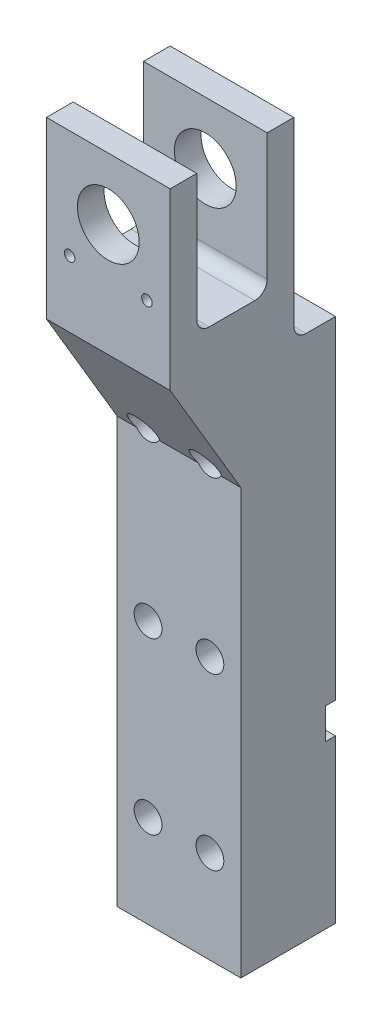
ISO-10303-21;
HEADER;
FILE_DESCRIPTION(('STEP AP214'),'2;1');
FILE_NAME('part.step','',(''),(''),'','','');
FILE_SCHEMA(('AUTOMOTIVE_DESIGN { 1 0 10303 214 1 1 1 1 }'));
ENDSEC;
DATA;
#1=APPLICATION_CONTEXT('core data for automotive mechanical design processes');
#2=APPLICATION_PROTOCOL_DEFINITION('international standard','automotive_design',2000,#1);
#3=PRODUCT_CONTEXT('',#1,'mechanical');
#4=PRODUCT('Part','Part','',(#3));
#5=PRODUCT_RELATED_PRODUCT_CATEGORY('part','',(#4));
#6=PRODUCT_DEFINITION_FORMATION('','',#4);
#7=PRODUCT_DEFINITION_CONTEXT('part definition',#1,'design');
#8=PRODUCT_DEFINITION('design','',#6,#7);
#9=PRODUCT_DEFINITION_SHAPE('','',#8);
#10=(LENGTH_UNIT() NAMED_UNIT(*) SI_UNIT(.MILLI.,.METRE.));
#11=(NAMED_UNIT(*) PLANE_ANGLE_UNIT() SI_UNIT($,.RADIAN.));
#12=(NAMED_UNIT(*) SI_UNIT($,.STERADIAN.) SOLID_ANGLE_UNIT());
#13=UNCERTAINTY_MEASURE_WITH_UNIT(LENGTH_MEASURE(1.E-05),#10,'distance_accuracy_value','');
#14=(GEOMETRIC_REPRESENTATION_CONTEXT(3) GLOBAL_UNCERTAINTY_ASSIGNED_CONTEXT((#13)) GLOBAL_UNIT_ASSIGNED_CONTEXT((#10,
#11,#12)) REPRESENTATION_CONTEXT('',''));
#15=CARTESIAN_POINT('',(0.,0.,0.));
#16=DIRECTION('',(0.,0.,1.));
#17=DIRECTION('',(1.,0.,0.));
#18=AXIS2_PLACEMENT_3D('',#15,#16,#17);
#19=CARTESIAN_POINT('',(0.,0.,0.));
#20=DIRECTION('',(0.,0.,1.));
#21=DIRECTION('',(1.,0.,0.));
#22=AXIS2_PLACEMENT_3D('',#19,#20,#21);
#23=PLANE('',#22);
#24=CARTESIAN_POINT('',(20.,47.5000000000001,0.));
#25=DIRECTION('',(0.,0.,-1.));
#26=DIRECTION('',(-1.,0.,0.));
#27=AXIS2_PLACEMENT_3D('',#24,#25,#26);
#28=CIRCLE('',#27,9.00000000000001);
#29=CARTESIAN_POINT('',(11.,47.5000000000001,0.));
#30=VERTEX_POINT('',#29);
#31=EDGE_CURVE('E262',#30,#30,#28,.T.);
#32=ORIENTED_EDGE('',*,*,#31,.F.);
#33=EDGE_LOOP('',(#32));
#34=FACE_BOUND('',#33,.T.);
#35=CARTESIAN_POINT('',(20.,-62.4999999999999,0.));
#36=DIRECTION('',(0.,0.,-1.));
#37=DIRECTION('',(-1.,0.,0.));
#38=AXIS2_PLACEMENT_3D('',#35,#36,#37);
#39=CIRCLE('',#38,9.00000000000001);
#40=CARTESIAN_POINT('',(11.,-62.4999999999999,0.));
#41=VERTEX_POINT('',#40);
#42=EDGE_CURVE('E251',#41,#41,#39,.T.);
#43=ORIENTED_EDGE('',*,*,#42,.F.);
#44=EDGE_LOOP('',(#43));
#45=FACE_BOUND('',#44,.T.);
#46=CARTESIAN_POINT('',(-20.,-62.4999999999999,0.));
#47=DIRECTION('',(0.,0.,-1.));
#48=DIRECTION('',(-1.,0.,0.));
#49=AXIS2_PLACEMENT_3D('',#46,#47,#48);
#50=CIRCLE('',#49,9.00000000000001);
#51=CARTESIAN_POINT('',(-29.,-62.4999999999999,0.));
#52=VERTEX_POINT('',#51);
#53=EDGE_CURVE('E232',#52,#52,#50,.T.);
#54=ORIENTED_EDGE('',*,*,#53,.F.);
#55=EDGE_LOOP('',(#54));
#56=FACE_BOUND('',#55,.T.);
#57=CARTESIAN_POINT('',(-20.,47.5000000000001,0.));
#58=DIRECTION('',(0.,0.,-1.));
#59=DIRECTION('',(-1.,0.,0.));
#60=AXIS2_PLACEMENT_3D('',#57,#58,#59);
#61=CIRCLE('',#60,9.00000000000001);
#62=CARTESIAN_POINT('',(-29.,47.5000000000001,0.));
#63=VERTEX_POINT('',#62);
#64=EDGE_CURVE('E239',#63,#63,#61,.T.);
#65=ORIENTED_EDGE('',*,*,#64,.F.);
#66=EDGE_LOOP('',(#65));
#67=FACE_BOUND('',#66,.T.);
#68=DIRECTION('',(0.,1.,0.));
#69=VECTOR('',#68,1.);
#70=CARTESIAN_POINT('',(40.,-232.5,0.));
#71=LINE('',#70,#69);
#72=CARTESIAN_POINT('',(40.,-107.5,0.));
#73=VERTEX_POINT('',#72);
#74=CARTESIAN_POINT('',(40.,107.5,0.));
#75=VERTEX_POINT('',#74);
#76=EDGE_CURVE('E373',#73,#75,#71,.T.);
#77=ORIENTED_EDGE('',*,*,#76,.F.);
#78=DIRECTION('',(1.,0.,0.));
#79=VECTOR('',#78,1.);
#80=CARTESIAN_POINT('',(40.,-107.5,0.));
#81=LINE('',#80,#79);
#82=CARTESIAN_POINT('',(-40.,-107.5,0.));
#83=VERTEX_POINT('',#82);
#84=EDGE_CURVE('E211',#83,#73,#81,.T.);
#85=ORIENTED_EDGE('',*,*,#84,.F.);
#86=DIRECTION('',(0.,-1.,0.));
#87=VECTOR('',#86,1.);
#88=CARTESIAN_POINT('',(-40.,-232.5,0.));
#89=LINE('',#88,#87);
#90=CARTESIAN_POINT('',(-40.,107.5,0.));
#91=VERTEX_POINT('',#90);
#92=EDGE_CURVE('E367',#91,#83,#89,.T.);
#93=ORIENTED_EDGE('',*,*,#92,.F.);
#94=DIRECTION('',(-1.,0.,0.));
#95=VECTOR('',#94,1.);
#96=CARTESIAN_POINT('',(40.001,107.5,0.));
#97=LINE('',#96,#95);
#98=EDGE_CURVE('E330',#75,#91,#97,.T.);
#99=ORIENTED_EDGE('',*,*,#98,.F.);
#100=EDGE_LOOP('',(#77,#85,#93,#99));
#101=FACE_BOUND('',#100,.T.);
#102=ADVANCED_FACE('F39',(#34,#45,#56,#67,#101),#23,.F.);
#103=CARTESIAN_POINT('',(40.,232.5,107.));
#104=DIRECTION('',(0.,-1.,0.));
#105=DIRECTION('',(0.,0.,-1.));
#106=AXIS2_PLACEMENT_3D('',#103,#104,#105);
#107=PLANE('',#106);
#108=DIRECTION('',(0.,0.,-1.));
#109=VECTOR('',#108,1.);
#110=CARTESIAN_POINT('',(40.,232.5,107.));
#111=LINE('',#110,#109);
#112=CARTESIAN_POINT('',(40.,232.5,107.));
#113=VERTEX_POINT('',#112);
#114=CARTESIAN_POINT('',(40.,232.5,89.75));
#115=VERTEX_POINT('',#114);
#116=EDGE_CURVE('E380',#113,#115,#111,.T.);
#117=ORIENTED_EDGE('',*,*,#116,.T.);
#118=DIRECTION('',(-1.,0.,0.));
#119=VECTOR('',#118,1.);
#120=CARTESIAN_POINT('',(40.001,232.5,89.75));
#121=LINE('',#120,#119);
#122=CARTESIAN_POINT('',(-40.,232.5,89.75));
#123=VERTEX_POINT('',#122);
#124=EDGE_CURVE('E353',#115,#123,#121,.T.);
#125=ORIENTED_EDGE('',*,*,#124,.T.);
#126=DIRECTION('',(0.,0.,-1.));
#127=VECTOR('',#126,1.);
#128=CARTESIAN_POINT('',(-40.,232.5,107.));
#129=LINE('',#128,#127);
#130=CARTESIAN_POINT('',(-40.,232.5,107.));
#131=VERTEX_POINT('',#130);
#132=EDGE_CURVE('E376',#131,#123,#129,.T.);
#133=ORIENTED_EDGE('',*,*,#132,.F.);
#134=DIRECTION('',(-1.,0.,0.));
#135=VECTOR('',#134,1.);
#136=CARTESIAN_POINT('',(40.,232.5,107.));
#137=LINE('',#136,#135);
#138=EDGE_CURVE('E364',#113,#131,#137,.T.);
#139=ORIENTED_EDGE('',*,*,#138,.F.);
#140=EDGE_LOOP('',(#117,#125,#133,#139));
#141=FACE_BOUND('',#140,.T.);
#142=ADVANCED_FACE('F486',(#141),#107,.F.);
#143=CARTESIAN_POINT('',(-40.,-232.5,107.));
#144=DIRECTION('',(1.,0.,0.));
#145=DIRECTION('',(0.,1.,0.));
#146=AXIS2_PLACEMENT_3D('',#143,#144,#145);
#147=PLANE('',#146);
#148=ORIENTED_EDGE('',*,*,#92,.T.);
#149=DIRECTION('',(0.,0.,-1.));
#150=VECTOR('',#149,1.);
#151=CARTESIAN_POINT('',(-40.,-107.5,6.5));
#152=LINE('',#151,#150);
#153=CARTESIAN_POINT('',(-40.,-107.5,6.5));
#154=VERTEX_POINT('',#153);
#155=EDGE_CURVE('E226',#154,#83,#152,.T.);
#156=ORIENTED_EDGE('',*,*,#155,.F.);
#157=DIRECTION('',(0.,1.,0.));
#158=VECTOR('',#157,1.);
#159=CARTESIAN_POINT('',(-40.,-107.5,6.5));
#160=LINE('',#159,#158);
#161=CARTESIAN_POINT('',(-40.,-127.5,6.5));
#162=VERTEX_POINT('',#161);
#163=EDGE_CURVE('E214',#162,#154,#160,.T.);
#164=ORIENTED_EDGE('',*,*,#163,.F.);
#165=DIRECTION('',(0.,0.,-1.));
#166=VECTOR('',#165,1.);
#167=CARTESIAN_POINT('',(-40.,-127.5,6.5));
#168=LINE('',#167,#166);
#169=CARTESIAN_POINT('',(-40.,-127.5,0.));
#170=VERTEX_POINT('',#169);
#171=EDGE_CURVE('E228',#162,#170,#168,.T.);
#172=ORIENTED_EDGE('',*,*,#171,.T.);
#173=CARTESIAN_POINT('',(-40.,-232.5,0.));
#174=VERTEX_POINT('',#173);
#175=EDGE_CURVE('E334',#170,#174,#89,.T.);
#176=ORIENTED_EDGE('',*,*,#175,.T.);
#177=DIRECTION('',(0.,0.,-1.));
#178=VECTOR('',#177,1.);
#179=CARTESIAN_POINT('',(-40.,-232.5,107.));
#180=LINE('',#179,#178);
#181=CARTESIAN_POINT('',(-40.,-232.5,61.2771919136702));
#182=VERTEX_POINT('',#181);
#183=EDGE_CURVE('E385',#182,#174,#180,.T.);
#184=ORIENTED_EDGE('',*,*,#183,.F.);
#185=DIRECTION('',(0.,-1.,0.));
#186=VECTOR('',#185,1.);
#187=CARTESIAN_POINT('',(-40.,42.3119245533763,61.2771919136702));
#188=LINE('',#187,#186);
#189=CARTESIAN_POINT('',(-40.,42.3119245533763,61.2771919136702));
#190=VERTEX_POINT('',#189);
#191=EDGE_CURVE('E297',#190,#182,#188,.T.);
#192=ORIENTED_EDGE('',*,*,#191,.F.);
#193=DIRECTION('',(0.,-0.860469588712237,-0.509501802647835));
#194=VECTOR('',#193,1.);
#195=CARTESIAN_POINT('',(-40.,119.530661885316,107.));
#196=LINE('',#195,#194);
#197=CARTESIAN_POINT('',(-40.,119.530661885316,107.));
#198=VERTEX_POINT('',#197);
#199=EDGE_CURVE('E294',#198,#190,#196,.T.);
#200=ORIENTED_EDGE('',*,*,#199,.F.);
#201=DIRECTION('',(0.,-1.,0.));
#202=VECTOR('',#201,1.);
#203=CARTESIAN_POINT('',(-40.,-232.5,107.));
#204=LINE('',#203,#202);
#205=EDGE_CURVE('E358',#131,#198,#204,.T.);
#206=ORIENTED_EDGE('',*,*,#205,.F.);
#207=ORIENTED_EDGE('',*,*,#132,.T.);
#208=DIRECTION('',(0.,1.,0.));
#209=VECTOR('',#208,1.);
#210=CARTESIAN_POINT('',(-40.,142.5,89.75));
#211=LINE('',#210,#209);
#212=CARTESIAN_POINT('',(-40.,150.5,89.75));
#213=VERTEX_POINT('',#212);
#214=EDGE_CURVE('E350',#213,#123,#211,.T.);
#215=ORIENTED_EDGE('',*,*,#214,.F.);
#216=CARTESIAN_POINT('',(-40.,150.5,81.75));
#217=DIRECTION('',(1.,0.,0.));
#218=DIRECTION('',(0.,1.,0.));
#219=AXIS2_PLACEMENT_3D('',#216,#217,#218);
#220=CIRCLE('',#219,8.);
#221=CARTESIAN_POINT('',(-40.,142.5,81.75));
#222=VERTEX_POINT('',#221);
#223=EDGE_CURVE('E399',#213,#222,#220,.T.);
#224=ORIENTED_EDGE('',*,*,#223,.T.);
#225=DIRECTION('',(0.,0.,1.));
#226=VECTOR('',#225,1.);
#227=CARTESIAN_POINT('',(-40.,142.5,44.25));
#228=LINE('',#227,#226);
#229=CARTESIAN_POINT('',(-40.,142.5,52.25));
#230=VERTEX_POINT('',#229);
#231=EDGE_CURVE('E347',#230,#222,#228,.T.);
#232=ORIENTED_EDGE('',*,*,#231,.F.);
#233=CARTESIAN_POINT('',(-40.,150.5,52.25));
#234=DIRECTION('',(1.,0.,0.));
#235=DIRECTION('',(0.,1.,0.));
#236=AXIS2_PLACEMENT_3D('',#233,#234,#235);
#237=CIRCLE('',#236,8.);
#238=CARTESIAN_POINT('',(-40.,150.5,44.25));
#239=VERTEX_POINT('',#238);
#240=EDGE_CURVE('E47',#230,#239,#237,.T.);
#241=ORIENTED_EDGE('',*,*,#240,.T.);
#242=DIRECTION('',(0.,-1.,0.));
#243=VECTOR('',#242,1.);
#244=CARTESIAN_POINT('',(-40.,232.5,44.25));
#245=LINE('',#244,#243);
#246=CARTESIAN_POINT('',(-40.,232.5,44.25));
#247=VERTEX_POINT('',#246);
#248=EDGE_CURVE('E345',#247,#239,#245,.T.);
#249=ORIENTED_EDGE('',*,*,#248,.F.);
#250=CARTESIAN_POINT('',(-40.,232.5,27.));
#251=VERTEX_POINT('',#250);
#252=EDGE_CURVE('E366',#247,#251,#129,.T.);
#253=ORIENTED_EDGE('',*,*,#252,.T.);
#254=DIRECTION('',(0.,1.,0.));
#255=VECTOR('',#254,1.);
#256=CARTESIAN_POINT('',(-40.,232.5,27.));
#257=LINE('',#256,#255);
#258=CARTESIAN_POINT('',(-40.,115.5,27.));
#259=VERTEX_POINT('',#258);
#260=EDGE_CURVE('E328',#259,#251,#257,.T.);
#261=ORIENTED_EDGE('',*,*,#260,.F.);
#262=CARTESIAN_POINT('',(-40.,115.5,19.));
#263=DIRECTION('',(-1.,0.,0.));
#264=DIRECTION('',(0.,1.,0.));
#265=AXIS2_PLACEMENT_3D('',#262,#263,#264);
#266=CIRCLE('',#265,8.);
#267=CARTESIAN_POINT('',(-40.,107.5,19.));
#268=VERTEX_POINT('',#267);
#269=EDGE_CURVE('E325',#268,#259,#266,.T.);
#270=ORIENTED_EDGE('',*,*,#269,.F.);
#271=DIRECTION('',(0.,0.,1.));
#272=VECTOR('',#271,1.);
#273=CARTESIAN_POINT('',(-40.,107.5,19.));
#274=LINE('',#273,#272);
#275=EDGE_CURVE('E322',#91,#268,#274,.T.);
#276=ORIENTED_EDGE('',*,*,#275,.F.);
#277=EDGE_LOOP('',(#148,#156,#164,#172,#176,#184,#192,#200,#206,#207,#215,#224,#232,#241,#249,
#253,#261,#270,#276));
#278=FACE_BOUND('',#277,.T.);
#279=ADVANCED_FACE('F416',(#278),#147,.F.);
#280=CARTESIAN_POINT('',(40.,-232.5,107.));
#281=DIRECTION('',(0.,1.,0.));
#282=DIRECTION('',(-1.,0.,0.));
#283=AXIS2_PLACEMENT_3D('',#280,#281,#282);
#284=PLANE('',#283);
#285=DIRECTION('',(0.,0.,-1.));
#286=VECTOR('',#285,1.);
#287=CARTESIAN_POINT('',(40.,-232.5,107.));
#288=LINE('',#287,#286);
#289=CARTESIAN_POINT('',(40.,-232.5,61.2771919136702));
#290=VERTEX_POINT('',#289);
#291=CARTESIAN_POINT('',(40.,-232.5,0.));
#292=VERTEX_POINT('',#291);
#293=EDGE_CURVE('E383',#290,#292,#288,.T.);
#294=ORIENTED_EDGE('',*,*,#293,.F.);
#295=DIRECTION('',(-1.,0.,0.));
#296=VECTOR('',#295,1.);
#297=CARTESIAN_POINT('',(40.001,-232.5,61.2771919136702));
#298=LINE('',#297,#296);
#299=EDGE_CURVE('E300',#290,#182,#298,.T.);
#300=ORIENTED_EDGE('',*,*,#299,.T.);
#301=ORIENTED_EDGE('',*,*,#183,.T.);
#302=DIRECTION('',(1.,0.,0.));
#303=VECTOR('',#302,1.);
#304=CARTESIAN_POINT('',(40.,-232.5,0.));
#305=LINE('',#304,#303);
#306=EDGE_CURVE('E370',#174,#292,#305,.T.);
#307=ORIENTED_EDGE('',*,*,#306,.T.);
#308=EDGE_LOOP('',(#294,#300,#301,#307));
#309=FACE_BOUND('',#308,.T.);
#310=ADVANCED_FACE('F465',(#309),#284,.F.);
#311=CARTESIAN_POINT('',(40.,-232.5,107.));
#312=DIRECTION('',(-1.,0.,0.));
#313=DIRECTION('',(0.,0.,1.));
#314=AXIS2_PLACEMENT_3D('',#311,#312,#313);
#315=PLANE('',#314);
#316=DIRECTION('',(0.,-1.,0.));
#317=VECTOR('',#316,1.);
#318=CARTESIAN_POINT('',(40.,-127.5,6.5));
#319=LINE('',#318,#317);
#320=CARTESIAN_POINT('',(40.,-107.5,6.5));
#321=VERTEX_POINT('',#320);
#322=CARTESIAN_POINT('',(40.,-127.5,6.5));
#323=VERTEX_POINT('',#322);
#324=EDGE_CURVE('E207',#321,#323,#319,.T.);
#325=ORIENTED_EDGE('',*,*,#324,.F.);
#326=DIRECTION('',(0.,0.,-1.));
#327=VECTOR('',#326,1.);
#328=CARTESIAN_POINT('',(40.,-107.5,6.5));
#329=LINE('',#328,#327);
#330=EDGE_CURVE('E222',#321,#73,#329,.T.);
#331=ORIENTED_EDGE('',*,*,#330,.T.);
#332=ORIENTED_EDGE('',*,*,#76,.T.);
#333=DIRECTION('',(0.,0.,-1.));
#334=VECTOR('',#333,1.);
#335=CARTESIAN_POINT('',(40.,107.5,19.));
#336=LINE('',#335,#334);
#337=CARTESIAN_POINT('',(40.,107.5,19.));
#338=VERTEX_POINT('',#337);
#339=EDGE_CURVE('E312',#338,#75,#336,.T.);
#340=ORIENTED_EDGE('',*,*,#339,.F.);
#341=CARTESIAN_POINT('',(40.,115.5,19.));
#342=DIRECTION('',(-1.,0.,0.));
#343=DIRECTION('',(0.,0.,1.));
#344=AXIS2_PLACEMENT_3D('',#341,#342,#343);
#345=CIRCLE('',#344,8.);
#346=CARTESIAN_POINT('',(40.,115.5,27.));
#347=VERTEX_POINT('',#346);
#348=EDGE_CURVE('E315',#347,#338,#345,.F.);
#349=ORIENTED_EDGE('',*,*,#348,.F.);
#350=DIRECTION('',(0.,-1.,0.));
#351=VECTOR('',#350,1.);
#352=CARTESIAN_POINT('',(40.,232.5,27.));
#353=LINE('',#352,#351);
#354=CARTESIAN_POINT('',(40.,232.5,27.));
#355=VERTEX_POINT('',#354);
#356=EDGE_CURVE('E319',#355,#347,#353,.T.);
#357=ORIENTED_EDGE('',*,*,#356,.F.);
#358=CARTESIAN_POINT('',(40.,232.5,44.25));
#359=VERTEX_POINT('',#358);
#360=EDGE_CURVE('E379',#359,#355,#111,.T.);
#361=ORIENTED_EDGE('',*,*,#360,.F.);
#362=DIRECTION('',(0.,1.,0.));
#363=VECTOR('',#362,1.);
#364=CARTESIAN_POINT('',(40.,232.5,44.25));
#365=LINE('',#364,#363);
#366=CARTESIAN_POINT('',(40.,150.5,44.25));
#367=VERTEX_POINT('',#366);
#368=EDGE_CURVE('E316',#367,#359,#365,.T.);
#369=ORIENTED_EDGE('',*,*,#368,.F.);
#370=CARTESIAN_POINT('',(40.,150.5,52.25));
#371=DIRECTION('',(-1.,0.,0.));
#372=DIRECTION('',(0.,0.,1.));
#373=AXIS2_PLACEMENT_3D('',#370,#371,#372);
#374=CIRCLE('',#373,8.);
#375=CARTESIAN_POINT('',(40.,142.5,52.25));
#376=VERTEX_POINT('',#375);
#377=EDGE_CURVE('E11',#367,#376,#374,.T.);
#378=ORIENTED_EDGE('',*,*,#377,.T.);
#379=DIRECTION('',(0.,0.,-1.));
#380=VECTOR('',#379,1.);
#381=CARTESIAN_POINT('',(40.,142.5,44.25));
#382=LINE('',#381,#380);
#383=CARTESIAN_POINT('',(40.,142.5,81.75));
#384=VERTEX_POINT('',#383);
#385=EDGE_CURVE('E311',#384,#376,#382,.T.);
#386=ORIENTED_EDGE('',*,*,#385,.F.);
#387=CARTESIAN_POINT('',(40.,150.5,81.75));
#388=DIRECTION('',(-1.,0.,0.));
#389=DIRECTION('',(0.,0.,1.));
#390=AXIS2_PLACEMENT_3D('',#387,#388,#389);
#391=CIRCLE('',#390,8.);
#392=CARTESIAN_POINT('',(40.,150.5,89.75));
#393=VERTEX_POINT('',#392);
#394=EDGE_CURVE('E401',#384,#393,#391,.T.);
#395=ORIENTED_EDGE('',*,*,#394,.T.);
#396=DIRECTION('',(0.,-1.,0.));
#397=VECTOR('',#396,1.);
#398=CARTESIAN_POINT('',(40.,142.5,89.75));
#399=LINE('',#398,#397);
#400=EDGE_CURVE('E342',#115,#393,#399,.T.);
#401=ORIENTED_EDGE('',*,*,#400,.F.);
#402=ORIENTED_EDGE('',*,*,#116,.F.);
#403=DIRECTION('',(0.,1.,0.));
#404=VECTOR('',#403,1.);
#405=CARTESIAN_POINT('',(40.,-232.5,107.));
#406=LINE('',#405,#404);
#407=CARTESIAN_POINT('',(40.,119.530661885316,107.));
#408=VERTEX_POINT('',#407);
#409=EDGE_CURVE('E361',#408,#113,#406,.T.);
#410=ORIENTED_EDGE('',*,*,#409,.F.);
#411=DIRECTION('',(0.,0.860469588712237,0.509501802647835));
#412=VECTOR('',#411,1.);
#413=CARTESIAN_POINT('',(40.,119.530661885316,107.));
#414=LINE('',#413,#412);
#415=CARTESIAN_POINT('',(40.,42.3119245533763,61.2771919136702));
#416=VERTEX_POINT('',#415);
#417=EDGE_CURVE('E303',#416,#408,#414,.T.);
#418=ORIENTED_EDGE('',*,*,#417,.F.);
#419=DIRECTION('',(0.,1.,0.));
#420=VECTOR('',#419,1.);
#421=CARTESIAN_POINT('',(40.,42.3119245533763,61.2771919136702));
#422=LINE('',#421,#420);
#423=EDGE_CURVE('E291',#290,#416,#422,.T.);
#424=ORIENTED_EDGE('',*,*,#423,.F.);
#425=ORIENTED_EDGE('',*,*,#293,.T.);
#426=CARTESIAN_POINT('',(40.,-127.5,0.));
#427=VERTEX_POINT('',#426);
#428=EDGE_CURVE('E362',#292,#427,#71,.T.);
#429=ORIENTED_EDGE('',*,*,#428,.T.);
#430=DIRECTION('',(0.,0.,-1.));
#431=VECTOR('',#430,1.);
#432=CARTESIAN_POINT('',(40.,-127.5,6.5));
#433=LINE('',#432,#431);
#434=EDGE_CURVE('E219',#323,#427,#433,.T.);
#435=ORIENTED_EDGE('',*,*,#434,.F.);
#436=EDGE_LOOP('',(#325,#331,#332,#340,#349,#357,#361,#369,#378,#386,#395,#401,#402,#410,#418,
#424,#425,#429,#435));
#437=FACE_BOUND('',#436,.T.);
#438=ADVANCED_FACE('F407',(#437),#315,.F.);
#439=ORIENTED_EDGE('',*,*,#360,.T.);
#440=DIRECTION('',(-1.,0.,0.));
#441=VECTOR('',#440,1.);
#442=CARTESIAN_POINT('',(40.001,232.5,27.));
#443=LINE('',#442,#441);
#444=EDGE_CURVE('E331',#355,#251,#443,.T.);
#445=ORIENTED_EDGE('',*,*,#444,.T.);
#446=ORIENTED_EDGE('',*,*,#252,.F.);
#447=DIRECTION('',(-1.,0.,0.));
#448=VECTOR('',#447,1.);
#449=CARTESIAN_POINT('',(40.001,232.5,44.25));
#450=LINE('',#449,#448);
#451=EDGE_CURVE('E352',#359,#247,#450,.T.);
#452=ORIENTED_EDGE('',*,*,#451,.F.);
#453=EDGE_LOOP('',(#439,#445,#446,#452));
#454=FACE_BOUND('',#453,.T.);
#455=ADVANCED_FACE('F429',(#454),#107,.F.);
#456=CARTESIAN_POINT('',(0.,0.,107.));
#457=DIRECTION('',(0.,0.,1.));
#458=DIRECTION('',(1.,0.,0.));
#459=AXIS2_PLACEMENT_3D('',#456,#457,#458);
#460=PLANE('',#459);
#461=CARTESIAN_POINT('',(-25.,162.5,107.));
#462=DIRECTION('',(0.,0.,1.));
#463=DIRECTION('',(1.,0.,0.));
#464=AXIS2_PLACEMENT_3D('',#461,#462,#463);
#465=CIRCLE('',#464,3.39999999999999);
#466=CARTESIAN_POINT('',(-21.6,162.5,107.));
#467=VERTEX_POINT('',#466);
#468=EDGE_CURVE('E269',#467,#467,#465,.T.);
#469=ORIENTED_EDGE('',*,*,#468,.F.);
#470=EDGE_LOOP('',(#469));
#471=FACE_BOUND('',#470,.T.);
#472=CARTESIAN_POINT('',(25.,162.5,107.));
#473=DIRECTION('',(0.,0.,1.));
#474=DIRECTION('',(1.,0.,0.));
#475=AXIS2_PLACEMENT_3D('',#472,#473,#474);
#476=CIRCLE('',#475,3.39999999999999);
#477=CARTESIAN_POINT('',(28.4,162.5,107.));
#478=VERTEX_POINT('',#477);
#479=EDGE_CURVE('E275',#478,#478,#476,.T.);
#480=ORIENTED_EDGE('',*,*,#479,.F.);
#481=EDGE_LOOP('',(#480));
#482=FACE_BOUND('',#481,.T.);
#483=CARTESIAN_POINT('',(0.,192.5,107.));
#484=DIRECTION('',(0.,0.,1.));
#485=DIRECTION('',(1.,0.,0.));
#486=AXIS2_PLACEMENT_3D('',#483,#484,#485);
#487=CIRCLE('',#486,20.);
#488=CARTESIAN_POINT('',(20.,192.5,107.));
#489=VERTEX_POINT('',#488);
#490=EDGE_CURVE('E281',#489,#489,#487,.T.);
#491=ORIENTED_EDGE('',*,*,#490,.F.);
#492=EDGE_LOOP('',(#491));
#493=FACE_BOUND('',#492,.T.);
#494=DIRECTION('',(-1.,0.,0.));
#495=VECTOR('',#494,1.);
#496=CARTESIAN_POINT('',(40.001,119.530661885316,107.));
#497=LINE('',#496,#495);
#498=EDGE_CURVE('E299',#408,#198,#497,.T.);
#499=ORIENTED_EDGE('',*,*,#498,.F.);
#500=ORIENTED_EDGE('',*,*,#409,.T.);
#501=ORIENTED_EDGE('',*,*,#138,.T.);
#502=ORIENTED_EDGE('',*,*,#205,.T.);
#503=EDGE_LOOP('',(#499,#500,#501,#502));
#504=FACE_BOUND('',#503,.T.);
#505=ADVANCED_FACE('F482',(#471,#482,#493,#504),#460,.T.);
#506=CARTESIAN_POINT('',(20.,-172.5,0.));
#507=DIRECTION('',(0.,0.,-1.));
#508=DIRECTION('',(-1.,0.,0.));
#509=AXIS2_PLACEMENT_3D('',#506,#507,#508);
#510=CIRCLE('',#509,9.00000000000001);
#511=CARTESIAN_POINT('',(11.,-172.5,0.));
#512=VERTEX_POINT('',#511);
#513=EDGE_CURVE('E244',#512,#512,#510,.T.);
#514=ORIENTED_EDGE('',*,*,#513,.F.);
#515=EDGE_LOOP('',(#514));
#516=FACE_BOUND('',#515,.T.);
#517=CARTESIAN_POINT('',(-20.,-172.5,0.));
#518=DIRECTION('',(0.,0.,-1.));
#519=DIRECTION('',(-1.,0.,0.));
#520=AXIS2_PLACEMENT_3D('',#517,#518,#519);
#521=CIRCLE('',#520,9.00000000000001);
#522=CARTESIAN_POINT('',(-29.,-172.5,0.));
#523=VERTEX_POINT('',#522);
#524=EDGE_CURVE('E225',#523,#523,#521,.T.);
#525=ORIENTED_EDGE('',*,*,#524,.F.);
#526=EDGE_LOOP('',(#525));
#527=FACE_BOUND('',#526,.T.);
#528=ORIENTED_EDGE('',*,*,#175,.F.);
#529=DIRECTION('',(-1.,0.,0.));
#530=VECTOR('',#529,1.);
#531=CARTESIAN_POINT('',(-40.,-127.5,0.));
#532=LINE('',#531,#530);
#533=EDGE_CURVE('E206',#427,#170,#532,.T.);
#534=ORIENTED_EDGE('',*,*,#533,.F.);
#535=ORIENTED_EDGE('',*,*,#428,.F.);
#536=ORIENTED_EDGE('',*,*,#306,.F.);
#537=EDGE_LOOP('',(#528,#534,#535,#536));
#538=FACE_BOUND('',#537,.T.);
#539=ADVANCED_FACE('F461',(#516,#527,#538),#23,.F.);
#540=CARTESIAN_POINT('',(40.001,232.5,27.));
#541=DIRECTION('',(0.,0.,1.));
#542=DIRECTION('',(0.,-1.,0.));
#543=AXIS2_PLACEMENT_3D('',#540,#541,#542);
#544=PLANE('',#543);
#545=CARTESIAN_POINT('',(0.,192.5,27.));
#546=DIRECTION('',(0.,0.,1.));
#547=DIRECTION('',(0.,-1.,0.));
#548=AXIS2_PLACEMENT_3D('',#545,#546,#547);
#549=CIRCLE('',#548,20.);
#550=CARTESIAN_POINT('',(0.,172.5,27.));
#551=VERTEX_POINT('',#550);
#552=EDGE_CURVE('E284',#551,#551,#549,.F.);
#553=ORIENTED_EDGE('',*,*,#552,.F.);
#554=EDGE_LOOP('',(#553));
#555=FACE_BOUND('',#554,.T.);
#556=ORIENTED_EDGE('',*,*,#356,.T.);
#557=DIRECTION('',(-1.,0.,0.));
#558=VECTOR('',#557,1.);
#559=CARTESIAN_POINT('',(40.001,115.5,27.));
#560=LINE('',#559,#558);
#561=EDGE_CURVE('E335',#347,#259,#560,.T.);
#562=ORIENTED_EDGE('',*,*,#561,.T.);
#563=ORIENTED_EDGE('',*,*,#260,.T.);
#564=ORIENTED_EDGE('',*,*,#444,.F.);
#565=EDGE_LOOP('',(#556,#562,#563,#564));
#566=FACE_BOUND('',#565,.T.);
#567=ADVANCED_FACE('F435',(#555,#566),#544,.F.);
#568=CARTESIAN_POINT('',(40.001,115.5,19.));
#569=DIRECTION('',(-1.,0.,0.));
#570=DIRECTION('',(0.,-1.,0.));
#571=AXIS2_PLACEMENT_3D('',#568,#569,#570);
#572=CYLINDRICAL_SURFACE('',#571,8.);
#573=ORIENTED_EDGE('',*,*,#348,.T.);
#574=DIRECTION('',(-1.,0.,0.));
#575=VECTOR('',#574,1.);
#576=CARTESIAN_POINT('',(40.001,107.5,19.));
#577=LINE('',#576,#575);
#578=EDGE_CURVE('E337',#338,#268,#577,.T.);
#579=ORIENTED_EDGE('',*,*,#578,.T.);
#580=ORIENTED_EDGE('',*,*,#269,.T.);
#581=ORIENTED_EDGE('',*,*,#561,.F.);
#582=EDGE_LOOP('',(#573,#579,#580,#581));
#583=FACE_BOUND('',#582,.T.);
#584=ADVANCED_FACE('F438',(#583),#572,.F.);
#585=CARTESIAN_POINT('',(40.001,107.5,19.));
#586=DIRECTION('',(0.,-1.,0.));
#587=DIRECTION('',(0.,0.,-1.));
#588=AXIS2_PLACEMENT_3D('',#585,#586,#587);
#589=PLANE('',#588);
#590=ORIENTED_EDGE('',*,*,#339,.T.);
#591=ORIENTED_EDGE('',*,*,#98,.T.);
#592=ORIENTED_EDGE('',*,*,#275,.T.);
#593=ORIENTED_EDGE('',*,*,#578,.F.);
#594=EDGE_LOOP('',(#590,#591,#592,#593));
#595=FACE_BOUND('',#594,.T.);
#596=ADVANCED_FACE('F441',(#595),#589,.F.);
#597=CARTESIAN_POINT('',(40.001,142.5,89.75));
#598=DIRECTION('',(0.,0.,1.));
#599=DIRECTION('',(1.,0.,0.));
#600=AXIS2_PLACEMENT_3D('',#597,#598,#599);
#601=PLANE('',#600);
#602=CARTESIAN_POINT('',(-25.,162.5,89.75));
#603=DIRECTION('',(0.,0.,1.));
#604=DIRECTION('',(1.,0.,0.));
#605=AXIS2_PLACEMENT_3D('',#602,#603,#604);
#606=CIRCLE('',#605,3.39999999999999);
#607=CARTESIAN_POINT('',(-21.6,162.5,89.75));
#608=VERTEX_POINT('',#607);
#609=EDGE_CURVE('E272',#608,#608,#606,.T.);
#610=ORIENTED_EDGE('',*,*,#609,.T.);
#611=EDGE_LOOP('',(#610));
#612=FACE_BOUND('',#611,.T.);
#613=CARTESIAN_POINT('',(25.,162.5,89.75));
#614=DIRECTION('',(0.,0.,1.));
#615=DIRECTION('',(1.,0.,0.));
#616=AXIS2_PLACEMENT_3D('',#613,#614,#615);
#617=CIRCLE('',#616,3.39999999999999);
#618=CARTESIAN_POINT('',(28.4,162.5,89.75));
#619=VERTEX_POINT('',#618);
#620=EDGE_CURVE('E278',#619,#619,#617,.T.);
#621=ORIENTED_EDGE('',*,*,#620,.T.);
#622=EDGE_LOOP('',(#621));
#623=FACE_BOUND('',#622,.T.);
#624=CARTESIAN_POINT('',(0.,192.5,89.75));
#625=DIRECTION('',(0.,0.,1.));
#626=DIRECTION('',(1.,0.,0.));
#627=AXIS2_PLACEMENT_3D('',#624,#625,#626);
#628=CIRCLE('',#627,20.);
#629=CARTESIAN_POINT('',(20.,192.5,89.75));
#630=VERTEX_POINT('',#629);
#631=EDGE_CURVE('E288',#630,#630,#628,.T.);
#632=ORIENTED_EDGE('',*,*,#631,.T.);
#633=EDGE_LOOP('',(#632));
#634=FACE_BOUND('',#633,.T.);
#635=ORIENTED_EDGE('',*,*,#400,.T.);
#636=DIRECTION('',(-1.,0.,0.));
#637=VECTOR('',#636,1.);
#638=CARTESIAN_POINT('',(-40.,150.5,89.75));
#639=LINE('',#638,#637);
#640=EDGE_CURVE('E388',#393,#213,#639,.T.);
#641=ORIENTED_EDGE('',*,*,#640,.T.);
#642=ORIENTED_EDGE('',*,*,#214,.T.);
#643=ORIENTED_EDGE('',*,*,#124,.F.);
#644=EDGE_LOOP('',(#635,#641,#642,#643));
#645=FACE_BOUND('',#644,.T.);
#646=ADVANCED_FACE('F413',(#612,#623,#634,#645),#601,.F.);
#647=CARTESIAN_POINT('',(40.001,142.5,44.25));
#648=DIRECTION('',(0.,-1.,0.));
#649=DIRECTION('',(1.,0.,0.));
#650=AXIS2_PLACEMENT_3D('',#647,#648,#649);
#651=PLANE('',#650);
#652=ORIENTED_EDGE('',*,*,#231,.T.);
#653=DIRECTION('',(-1.,0.,0.));
#654=VECTOR('',#653,1.);
#655=CARTESIAN_POINT('',(40.,142.5,81.75));
#656=LINE('',#655,#654);
#657=EDGE_CURVE('E396',#222,#384,#656,.F.);
#658=ORIENTED_EDGE('',*,*,#657,.T.);
#659=ORIENTED_EDGE('',*,*,#385,.T.);
#660=DIRECTION('',(-1.,0.,0.));
#661=VECTOR('',#660,1.);
#662=CARTESIAN_POINT('',(-40.,142.5,52.25));
#663=LINE('',#662,#661);
#664=EDGE_CURVE('E393',#376,#230,#663,.T.);
#665=ORIENTED_EDGE('',*,*,#664,.T.);
#666=EDGE_LOOP('',(#652,#658,#659,#665));
#667=FACE_BOUND('',#666,.T.);
#668=ADVANCED_FACE('F418',(#667),#651,.F.);
#669=CARTESIAN_POINT('',(40.001,232.5,44.25));
#670=DIRECTION('',(0.,0.,-1.));
#671=DIRECTION('',(0.,1.,0.));
#672=AXIS2_PLACEMENT_3D('',#669,#670,#671);
#673=PLANE('',#672);
#674=CARTESIAN_POINT('',(0.,192.5,44.25));
#675=DIRECTION('',(0.,0.,-1.));
#676=DIRECTION('',(0.,1.,0.));
#677=AXIS2_PLACEMENT_3D('',#674,#675,#676);
#678=CIRCLE('',#677,20.);
#679=CARTESIAN_POINT('',(0.,212.5,44.25));
#680=VERTEX_POINT('',#679);
#681=EDGE_CURVE('E287',#680,#680,#678,.T.);
#682=ORIENTED_EDGE('',*,*,#681,.T.);
#683=EDGE_LOOP('',(#682));
#684=FACE_BOUND('',#683,.T.);
#685=ORIENTED_EDGE('',*,*,#248,.T.);
#686=DIRECTION('',(-1.,0.,0.));
#687=VECTOR('',#686,1.);
#688=CARTESIAN_POINT('',(40.,150.5,44.25));
#689=LINE('',#688,#687);
#690=EDGE_CURVE('E60',#239,#367,#689,.F.);
#691=ORIENTED_EDGE('',*,*,#690,.T.);
#692=ORIENTED_EDGE('',*,*,#368,.T.);
#693=ORIENTED_EDGE('',*,*,#451,.T.);
#694=EDGE_LOOP('',(#685,#691,#692,#693));
#695=FACE_BOUND('',#694,.T.);
#696=ADVANCED_FACE('F426',(#684,#695),#673,.F.);
#697=CARTESIAN_POINT('',(40.001,42.3119245533763,61.2771919136702));
#698=DIRECTION('',(0.,0.,-1.));
#699=DIRECTION('',(-1.,0.,0.));
#700=AXIS2_PLACEMENT_3D('',#697,#698,#699);
#701=PLANE('',#700);
#702=CARTESIAN_POINT('',(20.,-172.5,61.2771919136702));
#703=DIRECTION('',(0.,0.,-1.));
#704=DIRECTION('',(-1.,0.,0.));
#705=AXIS2_PLACEMENT_3D('',#702,#703,#704);
#706=CIRCLE('',#705,9.00000000000001);
#707=CARTESIAN_POINT('',(11.,-172.5,61.2771919136702));
#708=VERTEX_POINT('',#707);
#709=EDGE_CURVE('E247',#708,#708,#706,.F.);
#710=ORIENTED_EDGE('',*,*,#709,.F.);
#711=EDGE_LOOP('',(#710));
#712=FACE_BOUND('',#711,.T.);
#713=CARTESIAN_POINT('',(-20.,-62.4999999999999,61.2771919136702));
#714=DIRECTION('',(0.,0.,-1.));
#715=DIRECTION('',(-1.,0.,0.));
#716=AXIS2_PLACEMENT_3D('',#713,#714,#715);
#717=CIRCLE('',#716,9.00000000000001);
#718=CARTESIAN_POINT('',(-29.,-62.4999999999999,61.2771919136702));
#719=VERTEX_POINT('',#718);
#720=EDGE_CURVE('E235',#719,#719,#717,.F.);
#721=ORIENTED_EDGE('',*,*,#720,.F.);
#722=EDGE_LOOP('',(#721));
#723=FACE_BOUND('',#722,.T.);
#724=CARTESIAN_POINT('',(-20.,-172.5,61.2771919136702));
#725=DIRECTION('',(0.,0.,-1.));
#726=DIRECTION('',(-1.,0.,0.));
#727=AXIS2_PLACEMENT_3D('',#724,#725,#726);
#728=CIRCLE('',#727,9.00000000000001);
#729=CARTESIAN_POINT('',(-29.,-172.5,61.2771919136702));
#730=VERTEX_POINT('',#729);
#731=EDGE_CURVE('E236',#730,#730,#728,.F.);
#732=ORIENTED_EDGE('',*,*,#731,.F.);
#733=EDGE_LOOP('',(#732));
#734=FACE_BOUND('',#733,.T.);
#735=CARTESIAN_POINT('',(20.,-62.4999999999999,61.2771919136702));
#736=DIRECTION('',(0.,0.,-1.));
#737=DIRECTION('',(-1.,0.,0.));
#738=AXIS2_PLACEMENT_3D('',#735,#736,#737);
#739=CIRCLE('',#738,9.00000000000001);
#740=CARTESIAN_POINT('',(11.,-62.4999999999999,61.2771919136702));
#741=VERTEX_POINT('',#740);
#742=EDGE_CURVE('E259',#741,#741,#739,.F.);
#743=ORIENTED_EDGE('',*,*,#742,.F.);
#744=EDGE_LOOP('',(#743));
#745=FACE_BOUND('',#744,.T.);
#746=DIRECTION('',(-1.,0.,0.));
#747=VECTOR('',#746,1.);
#748=CARTESIAN_POINT('',(40.001,42.3119245533763,61.2771919136702));
#749=LINE('',#748,#747);
#750=CARTESIAN_POINT('',(12.6458261402018,42.3119245533763,61.2771919136702));
#751=VERTEX_POINT('',#750);
#752=CARTESIAN_POINT('',(-12.6458261402017,42.3119245533763,61.2771919136702));
#753=VERTEX_POINT('',#752);
#754=EDGE_CURVE('E307',#751,#753,#749,.T.);
#755=ORIENTED_EDGE('',*,*,#754,.T.);
#756=CARTESIAN_POINT('',(-20.,47.5000000000001,61.2771919136702));
#757=DIRECTION('',(0.,0.,-1.));
#758=DIRECTION('',(-1.,0.,0.));
#759=AXIS2_PLACEMENT_3D('',#756,#757,#758);
#760=CIRCLE('',#759,9.00000000000001);
#761=CARTESIAN_POINT('',(-27.3541738597982,42.3119245533763,61.2771919136702));
#762=VERTEX_POINT('',#761);
#763=EDGE_CURVE('E248',#762,#753,#760,.F.);
#764=ORIENTED_EDGE('',*,*,#763,.F.);
#765=EDGE_CURVE('E308',#762,#190,#749,.T.);
#766=ORIENTED_EDGE('',*,*,#765,.T.);
#767=ORIENTED_EDGE('',*,*,#191,.T.);
#768=ORIENTED_EDGE('',*,*,#299,.F.);
#769=ORIENTED_EDGE('',*,*,#423,.T.);
#770=CARTESIAN_POINT('',(27.3541738597982,42.3119245533763,61.2771919136702));
#771=VERTEX_POINT('',#770);
#772=EDGE_CURVE('E304',#416,#771,#749,.T.);
#773=ORIENTED_EDGE('',*,*,#772,.T.);
#774=CARTESIAN_POINT('',(20.,47.5000000000001,61.2771919136702));
#775=DIRECTION('',(0.,0.,-1.));
#776=DIRECTION('',(-1.,0.,0.));
#777=AXIS2_PLACEMENT_3D('',#774,#775,#776);
#778=CIRCLE('',#777,9.00000000000001);
#779=EDGE_CURVE('E267',#751,#771,#778,.F.);
#780=ORIENTED_EDGE('',*,*,#779,.F.);
#781=EDGE_LOOP('',(#755,#764,#766,#767,#768,#769,#773,#780));
#782=FACE_BOUND('',#781,.T.);
#783=ADVANCED_FACE('F471',(#712,#723,#734,#745,#782),#701,.F.);
#784=CARTESIAN_POINT('',(40.001,119.530661885316,107.));
#785=DIRECTION('',(0.,0.509501802647835,-0.860469588712237));
#786=DIRECTION('',(0.,0.860469588712237,0.509501802647835));
#787=AXIS2_PLACEMENT_3D('',#784,#785,#786);
#788=PLANE('',#787);
#789=ORIENTED_EDGE('',*,*,#765,.F.);
#790=CARTESIAN_POINT('',(-20.,47.5000000000001,64.3491584619403));
#791=DIRECTION('',(0.,0.509501802647835,-0.860469588712237));
#792=DIRECTION('',(0.,-0.860469588712237,-0.509501802647835));
#793=AXIS2_PLACEMENT_3D('',#790,#791,#792);
#794=ELLIPSE('',#793,10.459405094687,9.00000000000001);
#795=EDGE_CURVE('E254',#753,#762,#794,.F.);
#796=ORIENTED_EDGE('',*,*,#795,.F.);
#797=ORIENTED_EDGE('',*,*,#754,.F.);
#798=CARTESIAN_POINT('',(20.,47.5000000000001,64.3491584619403));
#799=DIRECTION('',(0.,0.509501802647835,-0.860469588712237));
#800=DIRECTION('',(0.,-0.860469588712237,-0.509501802647835));
#801=AXIS2_PLACEMENT_3D('',#798,#799,#800);
#802=ELLIPSE('',#801,10.459405094687,9.00000000000001);
#803=EDGE_CURVE('E265',#771,#751,#802,.F.);
#804=ORIENTED_EDGE('',*,*,#803,.F.);
#805=ORIENTED_EDGE('',*,*,#772,.F.);
#806=ORIENTED_EDGE('',*,*,#417,.T.);
#807=ORIENTED_EDGE('',*,*,#498,.T.);
#808=ORIENTED_EDGE('',*,*,#199,.T.);
#809=EDGE_LOOP('',(#789,#796,#797,#804,#805,#806,#807,#808));
#810=FACE_BOUND('',#809,.T.);
#811=ADVANCED_FACE('F477',(#810),#788,.F.);
#812=CARTESIAN_POINT('',(0.,192.5,-29.5685424949238));
#813=DIRECTION('',(0.,0.,1.));
#814=DIRECTION('',(1.,0.,0.));
#815=AXIS2_PLACEMENT_3D('',#812,#813,#814);
#816=CYLINDRICAL_SURFACE('',#815,20.);
#817=ORIENTED_EDGE('',*,*,#552,.T.);
#818=EDGE_LOOP('',(#817));
#819=FACE_BOUND('',#818,.T.);
#820=ORIENTED_EDGE('',*,*,#681,.F.);
#821=EDGE_LOOP('',(#820));
#822=FACE_BOUND('',#821,.T.);
#823=ADVANCED_FACE('F570',(#819,#822),#816,.F.);
#824=ORIENTED_EDGE('',*,*,#490,.T.);
#825=EDGE_LOOP('',(#824));
#826=FACE_BOUND('',#825,.T.);
#827=ORIENTED_EDGE('',*,*,#631,.F.);
#828=EDGE_LOOP('',(#827));
#829=FACE_BOUND('',#828,.T.);
#830=ADVANCED_FACE('F566',(#826,#829),#816,.F.);
#831=CARTESIAN_POINT('',(25.,162.5,107.));
#832=DIRECTION('',(0.,0.,1.));
#833=DIRECTION('',(1.,0.,0.));
#834=AXIS2_PLACEMENT_3D('',#831,#832,#833);
#835=CYLINDRICAL_SURFACE('',#834,3.39999999999999);
#836=ORIENTED_EDGE('',*,*,#620,.F.);
#837=EDGE_LOOP('',(#836));
#838=FACE_BOUND('',#837,.T.);
#839=ORIENTED_EDGE('',*,*,#479,.T.);
#840=EDGE_LOOP('',(#839));
#841=FACE_BOUND('',#840,.T.);
#842=ADVANCED_FACE('F562',(#838,#841),#835,.F.);
#843=CARTESIAN_POINT('',(-25.,162.5,107.));
#844=DIRECTION('',(0.,0.,1.));
#845=DIRECTION('',(1.,0.,0.));
#846=AXIS2_PLACEMENT_3D('',#843,#844,#845);
#847=CYLINDRICAL_SURFACE('',#846,3.39999999999999);
#848=ORIENTED_EDGE('',*,*,#609,.F.);
#849=EDGE_LOOP('',(#848));
#850=FACE_BOUND('',#849,.T.);
#851=ORIENTED_EDGE('',*,*,#468,.T.);
#852=EDGE_LOOP('',(#851));
#853=FACE_BOUND('',#852,.T.);
#854=ADVANCED_FACE('F558',(#850,#853),#847,.F.);
#855=CARTESIAN_POINT('',(20.,47.5000000000001,107.001));
#856=DIRECTION('',(0.,0.,-1.));
#857=DIRECTION('',(-1.,0.,0.));
#858=AXIS2_PLACEMENT_3D('',#855,#856,#857);
#859=CYLINDRICAL_SURFACE('',#858,9.00000000000001);
#860=ORIENTED_EDGE('',*,*,#31,.T.);
#861=EDGE_LOOP('',(#860));
#862=FACE_BOUND('',#861,.T.);
#863=ORIENTED_EDGE('',*,*,#779,.T.);
#864=ORIENTED_EDGE('',*,*,#803,.T.);
#865=EDGE_LOOP('',(#863,#864));
#866=FACE_BOUND('',#865,.T.);
#867=ADVANCED_FACE('F551',(#862,#866),#859,.F.);
#868=CARTESIAN_POINT('',(-20.,47.5000000000001,107.001));
#869=DIRECTION('',(0.,0.,-1.));
#870=DIRECTION('',(-1.,0.,0.));
#871=AXIS2_PLACEMENT_3D('',#868,#869,#870);
#872=CYLINDRICAL_SURFACE('',#871,9.00000000000001);
#873=ORIENTED_EDGE('',*,*,#64,.T.);
#874=EDGE_LOOP('',(#873));
#875=FACE_BOUND('',#874,.T.);
#876=ORIENTED_EDGE('',*,*,#763,.T.);
#877=ORIENTED_EDGE('',*,*,#795,.T.);
#878=EDGE_LOOP('',(#876,#877));
#879=FACE_BOUND('',#878,.T.);
#880=ADVANCED_FACE('F548',(#875,#879),#872,.F.);
#881=CARTESIAN_POINT('',(20.,-62.4999999999999,107.001));
#882=DIRECTION('',(0.,0.,-1.));
#883=DIRECTION('',(-1.,0.,0.));
#884=AXIS2_PLACEMENT_3D('',#881,#882,#883);
#885=CYLINDRICAL_SURFACE('',#884,9.00000000000001);
#886=ORIENTED_EDGE('',*,*,#42,.T.);
#887=EDGE_LOOP('',(#886));
#888=FACE_BOUND('',#887,.T.);
#889=ORIENTED_EDGE('',*,*,#742,.T.);
#890=EDGE_LOOP('',(#889));
#891=FACE_BOUND('',#890,.T.);
#892=ADVANCED_FACE('F543',(#888,#891),#885,.F.);
#893=CARTESIAN_POINT('',(-20.,-172.5,107.001));
#894=DIRECTION('',(0.,0.,-1.));
#895=DIRECTION('',(-1.,0.,0.));
#896=AXIS2_PLACEMENT_3D('',#893,#894,#895);
#897=CYLINDRICAL_SURFACE('',#896,9.00000000000001);
#898=ORIENTED_EDGE('',*,*,#524,.T.);
#899=EDGE_LOOP('',(#898));
#900=FACE_BOUND('',#899,.T.);
#901=ORIENTED_EDGE('',*,*,#731,.T.);
#902=EDGE_LOOP('',(#901));
#903=FACE_BOUND('',#902,.T.);
#904=ADVANCED_FACE('F539',(#900,#903),#897,.F.);
#905=CARTESIAN_POINT('',(-20.,-62.4999999999999,107.001));
#906=DIRECTION('',(0.,0.,-1.));
#907=DIRECTION('',(-1.,0.,0.));
#908=AXIS2_PLACEMENT_3D('',#905,#906,#907);
#909=CYLINDRICAL_SURFACE('',#908,9.00000000000001);
#910=ORIENTED_EDGE('',*,*,#53,.T.);
#911=EDGE_LOOP('',(#910));
#912=FACE_BOUND('',#911,.T.);
#913=ORIENTED_EDGE('',*,*,#720,.T.);
#914=EDGE_LOOP('',(#913));
#915=FACE_BOUND('',#914,.T.);
#916=ADVANCED_FACE('F536',(#912,#915),#909,.F.);
#917=CARTESIAN_POINT('',(20.,-172.5,107.001));
#918=DIRECTION('',(0.,0.,-1.));
#919=DIRECTION('',(-1.,0.,0.));
#920=AXIS2_PLACEMENT_3D('',#917,#918,#919);
#921=CYLINDRICAL_SURFACE('',#920,9.00000000000001);
#922=ORIENTED_EDGE('',*,*,#513,.T.);
#923=EDGE_LOOP('',(#922));
#924=FACE_BOUND('',#923,.T.);
#925=ORIENTED_EDGE('',*,*,#709,.T.);
#926=EDGE_LOOP('',(#925));
#927=FACE_BOUND('',#926,.T.);
#928=ADVANCED_FACE('F533',(#924,#927),#921,.F.);
#929=CARTESIAN_POINT('',(40.,-107.5,6.5));
#930=DIRECTION('',(0.,1.,0.));
#931=DIRECTION('',(0.,0.,1.));
#932=AXIS2_PLACEMENT_3D('',#929,#930,#931);
#933=PLANE('',#932);
#934=ORIENTED_EDGE('',*,*,#84,.T.);
#935=ORIENTED_EDGE('',*,*,#330,.F.);
#936=DIRECTION('',(1.,0.,0.));
#937=VECTOR('',#936,1.);
#938=CARTESIAN_POINT('',(40.,-107.5,6.5));
#939=LINE('',#938,#937);
#940=EDGE_CURVE('E216',#154,#321,#939,.T.);
#941=ORIENTED_EDGE('',*,*,#940,.F.);
#942=ORIENTED_EDGE('',*,*,#155,.T.);
#943=EDGE_LOOP('',(#934,#935,#941,#942));
#944=FACE_BOUND('',#943,.T.);
#945=ADVANCED_FACE('F449',(#944),#933,.F.);
#946=CARTESIAN_POINT('',(-40.,-127.5,6.5));
#947=DIRECTION('',(0.,-1.,0.));
#948=DIRECTION('',(0.,0.,-1.));
#949=AXIS2_PLACEMENT_3D('',#946,#947,#948);
#950=PLANE('',#949);
#951=ORIENTED_EDGE('',*,*,#533,.T.);
#952=ORIENTED_EDGE('',*,*,#171,.F.);
#953=DIRECTION('',(-1.,0.,0.));
#954=VECTOR('',#953,1.);
#955=CARTESIAN_POINT('',(-40.,-127.5,6.5));
#956=LINE('',#955,#954);
#957=EDGE_CURVE('E210',#323,#162,#956,.T.);
#958=ORIENTED_EDGE('',*,*,#957,.F.);
#959=ORIENTED_EDGE('',*,*,#434,.T.);
#960=EDGE_LOOP('',(#951,#952,#958,#959));
#961=FACE_BOUND('',#960,.T.);
#962=ADVANCED_FACE('F529',(#961),#950,.F.);
#963=CARTESIAN_POINT('',(0.,0.,6.5));
#964=DIRECTION('',(0.,0.,1.));
#965=DIRECTION('',(1.,0.,0.));
#966=AXIS2_PLACEMENT_3D('',#963,#964,#965);
#967=PLANE('',#966);
#968=CARTESIAN_POINT('',(20.,-117.5,6.5));
#969=DIRECTION('',(0.,0.,-1.));
#970=DIRECTION('',(-1.,0.,0.));
#971=AXIS2_PLACEMENT_3D('',#968,#969,#970);
#972=CIRCLE('',#971,3.39999999999999);
#973=CARTESIAN_POINT('',(16.6,-117.5,6.5));
#974=VERTEX_POINT('',#973);
#975=EDGE_CURVE('E196',#974,#974,#972,.T.);
#976=ORIENTED_EDGE('',*,*,#975,.F.);
#977=EDGE_LOOP('',(#976));
#978=FACE_BOUND('',#977,.T.);
#979=CARTESIAN_POINT('',(-20.,-117.5,6.5));
#980=DIRECTION('',(0.,0.,-1.));
#981=DIRECTION('',(-1.,0.,0.));
#982=AXIS2_PLACEMENT_3D('',#979,#980,#981);
#983=CIRCLE('',#982,3.39999999999999);
#984=CARTESIAN_POINT('',(-23.4,-117.5,6.5));
#985=VERTEX_POINT('',#984);
#986=EDGE_CURVE('E195',#985,#985,#983,.T.);
#987=ORIENTED_EDGE('',*,*,#986,.F.);
#988=EDGE_LOOP('',(#987));
#989=FACE_BOUND('',#988,.T.);
#990=ORIENTED_EDGE('',*,*,#324,.T.);
#991=ORIENTED_EDGE('',*,*,#957,.T.);
#992=ORIENTED_EDGE('',*,*,#163,.T.);
#993=ORIENTED_EDGE('',*,*,#940,.T.);
#994=EDGE_LOOP('',(#990,#991,#992,#993));
#995=FACE_BOUND('',#994,.T.);
#996=ADVANCED_FACE('F453',(#978,#989,#995),#967,.F.);
#997=CARTESIAN_POINT('',(-20.,-117.5,31.5));
#998=DIRECTION('',(0.,0.,-1.));
#999=DIRECTION('',(-1.,0.,0.));
#1000=AXIS2_PLACEMENT_3D('',#997,#998,#999);
#1001=CONICAL_SURFACE('',#1000,3.39999999999999,1.02974425867665);
#1002=CARTESIAN_POINT('',(-20.,-117.5,33.5429261046937));
#1003=VERTEX_POINT('',#1002);
#1004=VERTEX_LOOP('',#1003);
#1005=FACE_BOUND('',#1004,.T.);
#1006=CARTESIAN_POINT('',(-20.,-117.5,31.5));
#1007=DIRECTION('',(0.,0.,-1.));
#1008=DIRECTION('',(-1.,0.,0.));
#1009=AXIS2_PLACEMENT_3D('',#1006,#1007,#1008);
#1010=CIRCLE('',#1009,3.39999999999999);
#1011=CARTESIAN_POINT('',(-23.4,-117.5,31.5));
#1012=VERTEX_POINT('',#1011);
#1013=EDGE_CURVE('E199',#1012,#1012,#1010,.T.);
#1014=ORIENTED_EDGE('',*,*,#1013,.T.);
#1015=EDGE_LOOP('',(#1014));
#1016=FACE_BOUND('',#1015,.T.);
#1017=ADVANCED_FACE('F522',(#1005,#1016),#1001,.F.);
#1018=CARTESIAN_POINT('',(-20.,-117.5,6.5));
#1019=DIRECTION('',(0.,0.,-1.));
#1020=DIRECTION('',(-1.,0.,0.));
#1021=AXIS2_PLACEMENT_3D('',#1018,#1019,#1020);
#1022=CYLINDRICAL_SURFACE('',#1021,3.39999999999999);
#1023=ORIENTED_EDGE('',*,*,#1013,.F.);
#1024=EDGE_LOOP('',(#1023));
#1025=FACE_BOUND('',#1024,.T.);
#1026=ORIENTED_EDGE('',*,*,#986,.T.);
#1027=EDGE_LOOP('',(#1026));
#1028=FACE_BOUND('',#1027,.T.);
#1029=ADVANCED_FACE('F189',(#1025,#1028),#1022,.F.);
#1030=CARTESIAN_POINT('',(20.,-117.5,31.5));
#1031=DIRECTION('',(0.,0.,-1.));
#1032=DIRECTION('',(-1.,0.,0.));
#1033=AXIS2_PLACEMENT_3D('',#1030,#1031,#1032);
#1034=CONICAL_SURFACE('',#1033,3.39999999999999,1.02974425867665);
#1035=CARTESIAN_POINT('',(20.,-117.5,33.5429261046937));
#1036=VERTEX_POINT('',#1035);
#1037=VERTEX_LOOP('',#1036);
#1038=FACE_BOUND('',#1037,.T.);
#1039=CARTESIAN_POINT('',(20.,-117.5,31.5));
#1040=DIRECTION('',(0.,0.,-1.));
#1041=DIRECTION('',(-1.,0.,0.));
#1042=AXIS2_PLACEMENT_3D('',#1039,#1040,#1041);
#1043=CIRCLE('',#1042,3.39999999999999);
#1044=CARTESIAN_POINT('',(16.6,-117.5,31.5));
#1045=VERTEX_POINT('',#1044);
#1046=EDGE_CURVE('E193',#1045,#1045,#1043,.T.);
#1047=ORIENTED_EDGE('',*,*,#1046,.T.);
#1048=EDGE_LOOP('',(#1047));
#1049=FACE_BOUND('',#1048,.T.);
#1050=ADVANCED_FACE('F185',(#1038,#1049),#1034,.F.);
#1051=CARTESIAN_POINT('',(20.,-117.5,6.5));
#1052=DIRECTION('',(0.,0.,-1.));
#1053=DIRECTION('',(-1.,0.,0.));
#1054=AXIS2_PLACEMENT_3D('',#1051,#1052,#1053);
#1055=CYLINDRICAL_SURFACE('',#1054,3.39999999999999);
#1056=ORIENTED_EDGE('',*,*,#1046,.F.);
#1057=EDGE_LOOP('',(#1056));
#1058=FACE_BOUND('',#1057,.T.);
#1059=ORIENTED_EDGE('',*,*,#975,.T.);
#1060=EDGE_LOOP('',(#1059));
#1061=FACE_BOUND('',#1060,.T.);
#1062=ADVANCED_FACE('F188',(#1058,#1061),#1055,.F.);
#1063=CARTESIAN_POINT('',(40.001,150.5,81.75));
#1064=DIRECTION('',(1.,0.,0.));
#1065=DIRECTION('',(0.,1.,0.));
#1066=AXIS2_PLACEMENT_3D('',#1063,#1064,#1065);
#1067=CYLINDRICAL_SURFACE('',#1066,8.);
#1068=ORIENTED_EDGE('',*,*,#394,.F.);
#1069=ORIENTED_EDGE('',*,*,#657,.F.);
#1070=ORIENTED_EDGE('',*,*,#223,.F.);
#1071=ORIENTED_EDGE('',*,*,#640,.F.);
#1072=EDGE_LOOP('',(#1068,#1069,#1070,#1071));
#1073=FACE_BOUND('',#1072,.T.);
#1074=ADVANCED_FACE('F415',(#1073),#1067,.F.);
#1075=CARTESIAN_POINT('',(40.001,150.5,52.25));
#1076=DIRECTION('',(1.,0.,0.));
#1077=DIRECTION('',(0.,1.,0.));
#1078=AXIS2_PLACEMENT_3D('',#1075,#1076,#1077);
#1079=CYLINDRICAL_SURFACE('',#1078,8.);
#1080=ORIENTED_EDGE('',*,*,#377,.F.);
#1081=ORIENTED_EDGE('',*,*,#690,.F.);
#1082=ORIENTED_EDGE('',*,*,#240,.F.);
#1083=ORIENTED_EDGE('',*,*,#664,.F.);
#1084=EDGE_LOOP('',(#1080,#1081,#1082,#1083));
#1085=FACE_BOUND('',#1084,.T.);
#1086=ADVANCED_FACE('F41',(#1085),#1079,.F.);
#1087=CLOSED_SHELL('',(#102,#142,#279,#310,#438,#455,#505,#539,#567,#584,#596,#646,#668,#696,
#783,#811,#823,#830,#842,#854,#867,#880,#892,#904,#916,#928,#945,#962,#996,#1017,#1029,#1050,
#1062,#1074,#1086));
#1088=MANIFOLD_SOLID_BREP('B2',#1087);
#1089=ADVANCED_BREP_SHAPE_REPRESENTATION('',(#18,#1088),#14);
#1090=SHAPE_DEFINITION_REPRESENTATION(#9,#1089);
ENDSEC;
END-ISO-10303-21;
